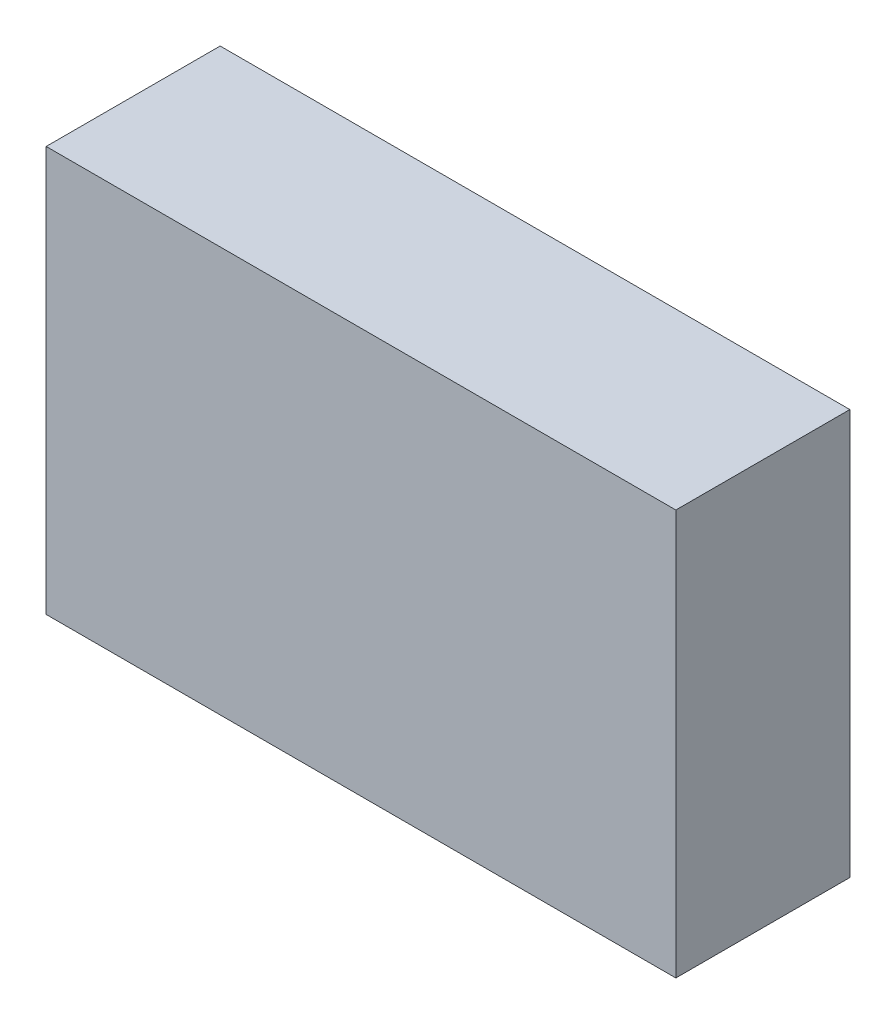
ISO-10303-21;
HEADER;
FILE_DESCRIPTION(('STEP AP214'),'2;1');
FILE_NAME('part.step','',(''),(''),'','','');
FILE_SCHEMA(('AUTOMOTIVE_DESIGN { 1 0 10303 214 1 1 1 1 }'));
ENDSEC;
DATA;
#1=APPLICATION_CONTEXT('core data for automotive mechanical design processes');
#2=APPLICATION_PROTOCOL_DEFINITION('international standard','automotive_design',2000,#1);
#3=PRODUCT_CONTEXT('',#1,'mechanical');
#4=PRODUCT('Part','Part','',(#3));
#5=PRODUCT_RELATED_PRODUCT_CATEGORY('part','',(#4));
#6=PRODUCT_DEFINITION_FORMATION('','',#4);
#7=PRODUCT_DEFINITION_CONTEXT('part definition',#1,'design');
#8=PRODUCT_DEFINITION('design','',#6,#7);
#9=PRODUCT_DEFINITION_SHAPE('','',#8);
#10=(LENGTH_UNIT() NAMED_UNIT(*) SI_UNIT(.MILLI.,.METRE.));
#11=(NAMED_UNIT(*) PLANE_ANGLE_UNIT() SI_UNIT($,.RADIAN.));
#12=(NAMED_UNIT(*) SI_UNIT($,.STERADIAN.) SOLID_ANGLE_UNIT());
#13=UNCERTAINTY_MEASURE_WITH_UNIT(LENGTH_MEASURE(1.E-05),#10,'distance_accuracy_value','');
#14=(GEOMETRIC_REPRESENTATION_CONTEXT(3) GLOBAL_UNCERTAINTY_ASSIGNED_CONTEXT((#13)) GLOBAL_UNIT_ASSIGNED_CONTEXT((#10,
#11,#12)) REPRESENTATION_CONTEXT('',''));
#15=CARTESIAN_POINT('',(0.,0.,0.));
#16=DIRECTION('',(0.,0.,1.));
#17=DIRECTION('',(1.,0.,0.));
#18=AXIS2_PLACEMENT_3D('',#15,#16,#17);
#19=CARTESIAN_POINT('',(29.5075006214044,1.34155996274844,0.));
#20=DIRECTION('',(1.,0.,0.));
#21=DIRECTION('',(0.,1.,0.));
#22=AXIS2_PLACEMENT_3D('',#19,#20,#21);
#23=PLANE('',#22);
#24=DIRECTION('',(0.,1.,0.));
#25=VECTOR('',#24,1.);
#26=CARTESIAN_POINT('',(29.5075006214044,0.642686956336626,0.));
#27=LINE('',#26,#25);
#28=CARTESIAN_POINT('',(29.5075006214044,0.642686956336626,0.));
#29=VERTEX_POINT('',#28);
#30=CARTESIAN_POINT('',(29.5075006214044,1.34155996274844,0.));
#31=VERTEX_POINT('',#30);
#32=EDGE_CURVE('E92',#29,#31,#27,.T.);
#33=ORIENTED_EDGE('',*,*,#32,.F.);
#34=DIRECTION('',(0.,0.,-1.));
#35=VECTOR('',#34,1.);
#36=CARTESIAN_POINT('',(29.5075006214044,0.642686956336626,0.));
#37=LINE('',#36,#35);
#38=CARTESIAN_POINT('',(29.5075006214044,0.642686956336626,-0.3));
#39=VERTEX_POINT('',#38);
#40=EDGE_CURVE('E78',#29,#39,#37,.T.);
#41=ORIENTED_EDGE('',*,*,#40,.T.);
#42=DIRECTION('',(0.,-1.,0.));
#43=VECTOR('',#42,1.);
#44=CARTESIAN_POINT('',(29.5075006214044,0.642686956336626,-0.3));
#45=LINE('',#44,#43);
#46=CARTESIAN_POINT('',(29.5075006214044,1.34155996274844,-0.3));
#47=VERTEX_POINT('',#46);
#48=EDGE_CURVE('E79',#47,#39,#45,.T.);
#49=ORIENTED_EDGE('',*,*,#48,.F.);
#50=DIRECTION('',(0.,0.,-1.));
#51=VECTOR('',#50,1.);
#52=CARTESIAN_POINT('',(29.5075006214044,1.34155996274844,0.));
#53=LINE('',#52,#51);
#54=EDGE_CURVE('E11',#31,#47,#53,.T.);
#55=ORIENTED_EDGE('',*,*,#54,.F.);
#56=EDGE_LOOP('',(#33,#41,#49,#55));
#57=FACE_BOUND('',#56,.T.);
#58=ADVANCED_FACE('F16',(#57),#23,.T.);
#59=CARTESIAN_POINT('',(28.421751486443,1.34155996274844,0.));
#60=DIRECTION('',(0.,1.,0.));
#61=DIRECTION('',(1.,0.,0.));
#62=AXIS2_PLACEMENT_3D('',#59,#60,#61);
#63=PLANE('',#62);
#64=DIRECTION('',(-1.,0.,0.));
#65=VECTOR('',#64,1.);
#66=CARTESIAN_POINT('',(29.5075006214044,1.34155996274844,0.));
#67=LINE('',#66,#65);
#68=CARTESIAN_POINT('',(28.421751486443,1.34155996274844,0.));
#69=VERTEX_POINT('',#68);
#70=EDGE_CURVE('E85',#31,#69,#67,.T.);
#71=ORIENTED_EDGE('',*,*,#70,.F.);
#72=ORIENTED_EDGE('',*,*,#54,.T.);
#73=DIRECTION('',(1.,0.,0.));
#74=VECTOR('',#73,1.);
#75=CARTESIAN_POINT('',(29.5075006214044,1.34155996274844,-0.3));
#76=LINE('',#75,#74);
#77=CARTESIAN_POINT('',(28.421751486443,1.34155996274844,-0.3));
#78=VERTEX_POINT('',#77);
#79=EDGE_CURVE('E108',#78,#47,#76,.T.);
#80=ORIENTED_EDGE('',*,*,#79,.F.);
#81=DIRECTION('',(0.,0.,-1.));
#82=VECTOR('',#81,1.);
#83=CARTESIAN_POINT('',(28.421751486443,1.34155996274844,0.));
#84=LINE('',#83,#82);
#85=EDGE_CURVE('E27',#69,#78,#84,.T.);
#86=ORIENTED_EDGE('',*,*,#85,.F.);
#87=EDGE_LOOP('',(#71,#72,#80,#86));
#88=FACE_BOUND('',#87,.T.);
#89=ADVANCED_FACE('F139',(#88),#63,.T.);
#90=CARTESIAN_POINT('',(28.421751486443,0.642686956336626,0.));
#91=DIRECTION('',(-1.,0.,0.));
#92=DIRECTION('',(0.,0.,1.));
#93=AXIS2_PLACEMENT_3D('',#90,#91,#92);
#94=PLANE('',#93);
#95=DIRECTION('',(0.,-1.,0.));
#96=VECTOR('',#95,1.);
#97=CARTESIAN_POINT('',(28.421751486443,1.34155996274844,0.));
#98=LINE('',#97,#96);
#99=CARTESIAN_POINT('',(28.421751486443,0.642686956336626,0.));
#100=VERTEX_POINT('',#99);
#101=EDGE_CURVE('E20',#69,#100,#98,.T.);
#102=ORIENTED_EDGE('',*,*,#101,.F.);
#103=ORIENTED_EDGE('',*,*,#85,.T.);
#104=DIRECTION('',(0.,1.,0.));
#105=VECTOR('',#104,1.);
#106=CARTESIAN_POINT('',(28.421751486443,1.34155996274844,-0.3));
#107=LINE('',#106,#105);
#108=CARTESIAN_POINT('',(28.421751486443,0.642686956336626,-0.3));
#109=VERTEX_POINT('',#108);
#110=EDGE_CURVE('E72',#109,#78,#107,.T.);
#111=ORIENTED_EDGE('',*,*,#110,.F.);
#112=DIRECTION('',(0.,0.,-1.));
#113=VECTOR('',#112,1.);
#114=CARTESIAN_POINT('',(28.421751486443,0.642686956336626,0.));
#115=LINE('',#114,#113);
#116=EDGE_CURVE('E67',#100,#109,#115,.T.);
#117=ORIENTED_EDGE('',*,*,#116,.F.);
#118=EDGE_LOOP('',(#102,#103,#111,#117));
#119=FACE_BOUND('',#118,.T.);
#120=ADVANCED_FACE('F69',(#119),#94,.T.);
#121=CARTESIAN_POINT('',(29.5075006214044,0.642686956336626,0.));
#122=DIRECTION('',(0.,-1.,0.));
#123=DIRECTION('',(0.,0.,-1.));
#124=AXIS2_PLACEMENT_3D('',#121,#122,#123);
#125=PLANE('',#124);
#126=DIRECTION('',(1.,0.,0.));
#127=VECTOR('',#126,1.);
#128=CARTESIAN_POINT('',(28.421751486443,0.642686956336626,0.));
#129=LINE('',#128,#127);
#130=EDGE_CURVE('E84',#100,#29,#129,.T.);
#131=ORIENTED_EDGE('',*,*,#130,.F.);
#132=ORIENTED_EDGE('',*,*,#116,.T.);
#133=DIRECTION('',(-1.,0.,0.));
#134=VECTOR('',#133,1.);
#135=CARTESIAN_POINT('',(28.421751486443,0.642686956336626,-0.3));
#136=LINE('',#135,#134);
#137=EDGE_CURVE('E87',#39,#109,#136,.T.);
#138=ORIENTED_EDGE('',*,*,#137,.F.);
#139=ORIENTED_EDGE('',*,*,#40,.F.);
#140=EDGE_LOOP('',(#131,#132,#138,#139));
#141=FACE_BOUND('',#140,.T.);
#142=ADVANCED_FACE('F88',(#141),#125,.T.);
#143=CARTESIAN_POINT('',(28.9646260539237,0.992123459542534,-0.3));
#144=DIRECTION('',(0.,0.,-1.));
#145=DIRECTION('',(0.,-1.,0.));
#146=AXIS2_PLACEMENT_3D('',#143,#144,#145);
#147=PLANE('',#146);
#148=ORIENTED_EDGE('',*,*,#137,.T.);
#149=ORIENTED_EDGE('',*,*,#110,.T.);
#150=ORIENTED_EDGE('',*,*,#79,.T.);
#151=ORIENTED_EDGE('',*,*,#48,.T.);
#152=EDGE_LOOP('',(#148,#149,#150,#151));
#153=FACE_BOUND('',#152,.T.);
#154=ADVANCED_FACE('F18',(#153),#147,.T.);
#155=CARTESIAN_POINT('',(28.9646260539237,0.992123459542534,0.));
#156=DIRECTION('',(0.,0.,-1.));
#157=DIRECTION('',(0.,-1.,0.));
#158=AXIS2_PLACEMENT_3D('',#155,#156,#157);
#159=PLANE('',#158);
#160=ORIENTED_EDGE('',*,*,#130,.T.);
#161=ORIENTED_EDGE('',*,*,#32,.T.);
#162=ORIENTED_EDGE('',*,*,#70,.T.);
#163=ORIENTED_EDGE('',*,*,#101,.T.);
#164=EDGE_LOOP('',(#160,#161,#162,#163));
#165=FACE_BOUND('',#164,.T.);
#166=ADVANCED_FACE('F82',(#165),#159,.F.);
#167=CLOSED_SHELL('',(#58,#89,#120,#142,#154,#166));
#168=MANIFOLD_SOLID_BREP('B1',#167);
#169=ADVANCED_BREP_SHAPE_REPRESENTATION('',(#18,#168),#14);
#170=SHAPE_DEFINITION_REPRESENTATION(#9,#169);
ENDSEC;
END-ISO-10303-21;
